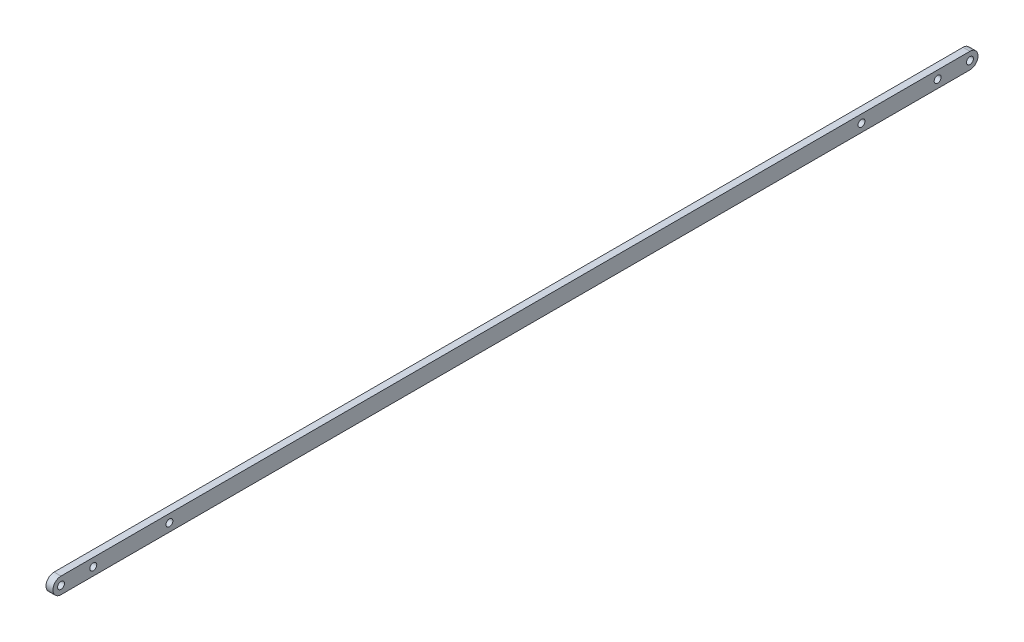
ISO-10303-21;
HEADER;
FILE_DESCRIPTION(('STEP AP214'),'2;1');
FILE_NAME('part.step','',(''),(''),'','','');
FILE_SCHEMA(('AUTOMOTIVE_DESIGN { 1 0 10303 214 1 1 1 1 }'));
ENDSEC;
DATA;
#1=APPLICATION_CONTEXT('core data for automotive mechanical design processes');
#2=APPLICATION_PROTOCOL_DEFINITION('international standard','automotive_design',2000,#1);
#3=PRODUCT_CONTEXT('',#1,'mechanical');
#4=PRODUCT('Part','Part','',(#3));
#5=PRODUCT_RELATED_PRODUCT_CATEGORY('part','',(#4));
#6=PRODUCT_DEFINITION_FORMATION('','',#4);
#7=PRODUCT_DEFINITION_CONTEXT('part definition',#1,'design');
#8=PRODUCT_DEFINITION('design','',#6,#7);
#9=PRODUCT_DEFINITION_SHAPE('','',#8);
#10=(LENGTH_UNIT() NAMED_UNIT(*) SI_UNIT(.MILLI.,.METRE.));
#11=(NAMED_UNIT(*) PLANE_ANGLE_UNIT() SI_UNIT($,.RADIAN.));
#12=(NAMED_UNIT(*) SI_UNIT($,.STERADIAN.) SOLID_ANGLE_UNIT());
#13=UNCERTAINTY_MEASURE_WITH_UNIT(LENGTH_MEASURE(1.E-05),#10,'distance_accuracy_value','');
#14=(GEOMETRIC_REPRESENTATION_CONTEXT(3) GLOBAL_UNCERTAINTY_ASSIGNED_CONTEXT((#13)) GLOBAL_UNIT_ASSIGNED_CONTEXT((#10,
#11,#12)) REPRESENTATION_CONTEXT('',''));
#15=CARTESIAN_POINT('',(0.,0.,0.));
#16=DIRECTION('',(0.,0.,1.));
#17=DIRECTION('',(1.,0.,0.));
#18=AXIS2_PLACEMENT_3D('',#15,#16,#17);
#19=CARTESIAN_POINT('',(3.,1.5,0.));
#20=DIRECTION('',(1.,0.,0.));
#21=DIRECTION('',(0.,0.,-1.));
#22=AXIS2_PLACEMENT_3D('',#19,#20,#21);
#23=PLANE('',#22);
#24=CARTESIAN_POINT('',(3.,1.5,-47.));
#25=DIRECTION('',(1.,0.,0.));
#26=DIRECTION('',(0.,0.,-1.));
#27=AXIS2_PLACEMENT_3D('',#24,#25,#26);
#28=CIRCLE('',#27,1.5);
#29=CARTESIAN_POINT('',(3.,1.5,-48.5));
#30=VERTEX_POINT('',#29);
#31=EDGE_CURVE('E162',#30,#30,#28,.T.);
#32=ORIENTED_EDGE('',*,*,#31,.F.);
#33=EDGE_LOOP('',(#32));
#34=FACE_BOUND('',#33,.T.);
#35=CARTESIAN_POINT('',(3.,1.5,-14.));
#36=DIRECTION('',(1.,0.,0.));
#37=DIRECTION('',(0.,0.,-1.));
#38=AXIS2_PLACEMENT_3D('',#35,#36,#37);
#39=CIRCLE('',#38,1.5);
#40=CARTESIAN_POINT('',(3.,1.5,-15.5));
#41=VERTEX_POINT('',#40);
#42=EDGE_CURVE('E146',#41,#41,#39,.T.);
#43=ORIENTED_EDGE('',*,*,#42,.F.);
#44=EDGE_LOOP('',(#43));
#45=FACE_BOUND('',#44,.T.);
#46=CARTESIAN_POINT('',(3.,1.5,0.));
#47=DIRECTION('',(1.,0.,0.));
#48=DIRECTION('',(0.,0.,1.));
#49=AXIS2_PLACEMENT_3D('',#46,#47,#48);
#50=CIRCLE('',#49,1.5);
#51=CARTESIAN_POINT('',(3.,1.5,1.5));
#52=VERTEX_POINT('',#51);
#53=EDGE_CURVE('E116',#52,#52,#50,.T.);
#54=ORIENTED_EDGE('',*,*,#53,.F.);
#55=EDGE_LOOP('',(#54));
#56=FACE_BOUND('',#55,.T.);
#57=CARTESIAN_POINT('',(3.,1.5,0.));
#58=DIRECTION('',(1.,0.,0.));
#59=DIRECTION('',(0.,0.,-1.));
#60=AXIS2_PLACEMENT_3D('',#57,#58,#59);
#61=CIRCLE('',#60,3.5);
#62=CARTESIAN_POINT('',(3.,5.,0.));
#63=VERTEX_POINT('',#62);
#64=CARTESIAN_POINT('',(3.,-2.,0.));
#65=VERTEX_POINT('',#64);
#66=EDGE_CURVE('E96',#63,#65,#61,.T.);
#67=ORIENTED_EDGE('',*,*,#66,.T.);
#68=DIRECTION('',(0.,0.,-1.));
#69=VECTOR('',#68,1.);
#70=CARTESIAN_POINT('',(3.,-2.,0.));
#71=LINE('',#70,#69);
#72=CARTESIAN_POINT('',(3.,-2.,-394.));
#73=VERTEX_POINT('',#72);
#74=EDGE_CURVE('E91',#65,#73,#71,.T.);
#75=ORIENTED_EDGE('',*,*,#74,.T.);
#76=CARTESIAN_POINT('',(3.,1.5,-394.));
#77=DIRECTION('',(1.,0.,0.));
#78=DIRECTION('',(0.,0.,1.));
#79=AXIS2_PLACEMENT_3D('',#76,#77,#78);
#80=CIRCLE('',#79,3.5);
#81=CARTESIAN_POINT('',(3.,5.,-394.));
#82=VERTEX_POINT('',#81);
#83=EDGE_CURVE('E94',#73,#82,#80,.T.);
#84=ORIENTED_EDGE('',*,*,#83,.T.);
#85=DIRECTION('',(0.,0.,1.));
#86=VECTOR('',#85,1.);
#87=CARTESIAN_POINT('',(3.,5.,0.));
#88=LINE('',#87,#86);
#89=EDGE_CURVE('E61',#82,#63,#88,.T.);
#90=ORIENTED_EDGE('',*,*,#89,.T.);
#91=EDGE_LOOP('',(#67,#75,#84,#90));
#92=FACE_BOUND('',#91,.T.);
#93=CARTESIAN_POINT('',(3.,1.5,-394.));
#94=DIRECTION('',(1.,0.,0.));
#95=DIRECTION('',(0.,0.,1.));
#96=AXIS2_PLACEMENT_3D('',#93,#94,#95);
#97=CIRCLE('',#96,1.5);
#98=CARTESIAN_POINT('',(3.,1.5,-392.5));
#99=VERTEX_POINT('',#98);
#100=EDGE_CURVE('E138',#99,#99,#97,.T.);
#101=ORIENTED_EDGE('',*,*,#100,.F.);
#102=EDGE_LOOP('',(#101));
#103=FACE_BOUND('',#102,.T.);
#104=CARTESIAN_POINT('',(3.,1.5,-380.));
#105=DIRECTION('',(1.,0.,0.));
#106=DIRECTION('',(0.,0.,-1.));
#107=AXIS2_PLACEMENT_3D('',#104,#105,#106);
#108=CIRCLE('',#107,1.50000000000002);
#109=CARTESIAN_POINT('',(3.,1.5,-381.5));
#110=VERTEX_POINT('',#109);
#111=EDGE_CURVE('E154',#110,#110,#108,.T.);
#112=ORIENTED_EDGE('',*,*,#111,.F.);
#113=EDGE_LOOP('',(#112));
#114=FACE_BOUND('',#113,.T.);
#115=CARTESIAN_POINT('',(3.,1.5,-347.));
#116=DIRECTION('',(1.,0.,0.));
#117=DIRECTION('',(0.,0.,-1.));
#118=AXIS2_PLACEMENT_3D('',#115,#116,#117);
#119=CIRCLE('',#118,1.50000000000002);
#120=CARTESIAN_POINT('',(3.,1.5,-348.5));
#121=VERTEX_POINT('',#120);
#122=EDGE_CURVE('E170',#121,#121,#119,.T.);
#123=ORIENTED_EDGE('',*,*,#122,.F.);
#124=EDGE_LOOP('',(#123));
#125=FACE_BOUND('',#124,.T.);
#126=ADVANCED_FACE('F43',(#34,#45,#56,#92,#103,#114,#125),#23,.T.);
#127=CARTESIAN_POINT('',(0.,1.5,0.));
#128=DIRECTION('',(1.,0.,0.));
#129=DIRECTION('',(0.,0.,-1.));
#130=AXIS2_PLACEMENT_3D('',#127,#128,#129);
#131=PLANE('',#130);
#132=CARTESIAN_POINT('',(0.,1.5,0.));
#133=DIRECTION('',(1.,0.,0.));
#134=DIRECTION('',(0.,0.,-1.));
#135=AXIS2_PLACEMENT_3D('',#132,#133,#134);
#136=CIRCLE('',#135,3.5);
#137=CARTESIAN_POINT('',(0.,5.,0.));
#138=VERTEX_POINT('',#137);
#139=CARTESIAN_POINT('',(0.,-2.,0.));
#140=VERTEX_POINT('',#139);
#141=EDGE_CURVE('E112',#138,#140,#136,.T.);
#142=ORIENTED_EDGE('',*,*,#141,.F.);
#143=DIRECTION('',(0.,0.,1.));
#144=VECTOR('',#143,1.);
#145=CARTESIAN_POINT('',(0.,5.,0.));
#146=LINE('',#145,#144);
#147=CARTESIAN_POINT('',(0.,5.,-394.));
#148=VERTEX_POINT('',#147);
#149=EDGE_CURVE('E84',#148,#138,#146,.T.);
#150=ORIENTED_EDGE('',*,*,#149,.F.);
#151=CARTESIAN_POINT('',(0.,1.5,-394.));
#152=DIRECTION('',(1.,0.,0.));
#153=DIRECTION('',(0.,0.,1.));
#154=AXIS2_PLACEMENT_3D('',#151,#152,#153);
#155=CIRCLE('',#154,3.5);
#156=CARTESIAN_POINT('',(0.,-2.,-394.));
#157=VERTEX_POINT('',#156);
#158=EDGE_CURVE('E78',#157,#148,#155,.T.);
#159=ORIENTED_EDGE('',*,*,#158,.F.);
#160=DIRECTION('',(0.,0.,-1.));
#161=VECTOR('',#160,1.);
#162=CARTESIAN_POINT('',(0.,-2.,0.));
#163=LINE('',#162,#161);
#164=EDGE_CURVE('E101',#140,#157,#163,.T.);
#165=ORIENTED_EDGE('',*,*,#164,.F.);
#166=EDGE_LOOP('',(#142,#150,#159,#165));
#167=FACE_BOUND('',#166,.T.);
#168=CARTESIAN_POINT('',(0.,1.5,0.));
#169=DIRECTION('',(1.,0.,0.));
#170=DIRECTION('',(0.,0.,-1.));
#171=AXIS2_PLACEMENT_3D('',#168,#169,#170);
#172=CIRCLE('',#171,1.5);
#173=CARTESIAN_POINT('',(0.,1.5,-1.5));
#174=VERTEX_POINT('',#173);
#175=EDGE_CURVE('E134',#174,#174,#172,.T.);
#176=ORIENTED_EDGE('',*,*,#175,.T.);
#177=EDGE_LOOP('',(#176));
#178=FACE_BOUND('',#177,.T.);
#179=CARTESIAN_POINT('',(0.,1.5,-394.));
#180=DIRECTION('',(1.,0.,0.));
#181=DIRECTION('',(0.,0.,1.));
#182=AXIS2_PLACEMENT_3D('',#179,#180,#181);
#183=CIRCLE('',#182,1.5);
#184=CARTESIAN_POINT('',(0.,1.5,-392.5));
#185=VERTEX_POINT('',#184);
#186=EDGE_CURVE('E142',#185,#185,#183,.T.);
#187=ORIENTED_EDGE('',*,*,#186,.T.);
#188=EDGE_LOOP('',(#187));
#189=FACE_BOUND('',#188,.T.);
#190=CARTESIAN_POINT('',(0.,1.5,-14.));
#191=DIRECTION('',(1.,0.,0.));
#192=DIRECTION('',(0.,0.,-1.));
#193=AXIS2_PLACEMENT_3D('',#190,#191,#192);
#194=CIRCLE('',#193,1.5);
#195=CARTESIAN_POINT('',(0.,1.5,-15.5));
#196=VERTEX_POINT('',#195);
#197=EDGE_CURVE('E150',#196,#196,#194,.T.);
#198=ORIENTED_EDGE('',*,*,#197,.T.);
#199=EDGE_LOOP('',(#198));
#200=FACE_BOUND('',#199,.T.);
#201=CARTESIAN_POINT('',(0.,1.5,-380.));
#202=DIRECTION('',(1.,0.,0.));
#203=DIRECTION('',(0.,0.,-1.));
#204=AXIS2_PLACEMENT_3D('',#201,#202,#203);
#205=CIRCLE('',#204,1.50000000000002);
#206=CARTESIAN_POINT('',(0.,1.5,-381.5));
#207=VERTEX_POINT('',#206);
#208=EDGE_CURVE('E158',#207,#207,#205,.T.);
#209=ORIENTED_EDGE('',*,*,#208,.T.);
#210=EDGE_LOOP('',(#209));
#211=FACE_BOUND('',#210,.T.);
#212=CARTESIAN_POINT('',(0.,1.5,-47.));
#213=DIRECTION('',(1.,0.,0.));
#214=DIRECTION('',(0.,0.,-1.));
#215=AXIS2_PLACEMENT_3D('',#212,#213,#214);
#216=CIRCLE('',#215,1.5);
#217=CARTESIAN_POINT('',(0.,1.5,-48.5));
#218=VERTEX_POINT('',#217);
#219=EDGE_CURVE('E166',#218,#218,#216,.T.);
#220=ORIENTED_EDGE('',*,*,#219,.T.);
#221=EDGE_LOOP('',(#220));
#222=FACE_BOUND('',#221,.T.);
#223=CARTESIAN_POINT('',(0.,1.5,-347.));
#224=DIRECTION('',(1.,0.,0.));
#225=DIRECTION('',(0.,0.,-1.));
#226=AXIS2_PLACEMENT_3D('',#223,#224,#225);
#227=CIRCLE('',#226,1.50000000000002);
#228=CARTESIAN_POINT('',(0.,1.5,-348.5));
#229=VERTEX_POINT('',#228);
#230=EDGE_CURVE('E174',#229,#229,#227,.T.);
#231=ORIENTED_EDGE('',*,*,#230,.T.);
#232=EDGE_LOOP('',(#231));
#233=FACE_BOUND('',#232,.T.);
#234=ADVANCED_FACE('F129',(#167,#178,#189,#200,#211,#222,#233),#131,.F.);
#235=CARTESIAN_POINT('',(3.,1.5,0.));
#236=DIRECTION('',(-1.,0.,0.));
#237=DIRECTION('',(0.,0.,1.));
#238=AXIS2_PLACEMENT_3D('',#235,#236,#237);
#239=CYLINDRICAL_SURFACE('',#238,3.5);
#240=ORIENTED_EDGE('',*,*,#141,.T.);
#241=DIRECTION('',(-1.,0.,0.));
#242=VECTOR('',#241,1.);
#243=CARTESIAN_POINT('',(3.,-2.,0.));
#244=LINE('',#243,#242);
#245=EDGE_CURVE('E11',#65,#140,#244,.T.);
#246=ORIENTED_EDGE('',*,*,#245,.F.);
#247=ORIENTED_EDGE('',*,*,#66,.F.);
#248=DIRECTION('',(-1.,0.,0.));
#249=VECTOR('',#248,1.);
#250=CARTESIAN_POINT('',(3.,5.,0.));
#251=LINE('',#250,#249);
#252=EDGE_CURVE('E108',#63,#138,#251,.T.);
#253=ORIENTED_EDGE('',*,*,#252,.T.);
#254=EDGE_LOOP('',(#240,#246,#247,#253));
#255=FACE_BOUND('',#254,.T.);
#256=ADVANCED_FACE('F45',(#255),#239,.T.);
#257=CARTESIAN_POINT('',(3.,-2.,0.));
#258=DIRECTION('',(0.,1.,0.));
#259=DIRECTION('',(0.,0.,1.));
#260=AXIS2_PLACEMENT_3D('',#257,#258,#259);
#261=PLANE('',#260);
#262=ORIENTED_EDGE('',*,*,#164,.T.);
#263=DIRECTION('',(-1.,0.,0.));
#264=VECTOR('',#263,1.);
#265=CARTESIAN_POINT('',(3.,-2.,-394.));
#266=LINE('',#265,#264);
#267=EDGE_CURVE('E53',#73,#157,#266,.T.);
#268=ORIENTED_EDGE('',*,*,#267,.F.);
#269=ORIENTED_EDGE('',*,*,#74,.F.);
#270=ORIENTED_EDGE('',*,*,#245,.T.);
#271=EDGE_LOOP('',(#262,#268,#269,#270));
#272=FACE_BOUND('',#271,.T.);
#273=ADVANCED_FACE('F100',(#272),#261,.F.);
#274=CARTESIAN_POINT('',(3.,1.5,-394.));
#275=DIRECTION('',(-1.,0.,0.));
#276=DIRECTION('',(0.,0.,1.));
#277=AXIS2_PLACEMENT_3D('',#274,#275,#276);
#278=CYLINDRICAL_SURFACE('',#277,3.5);
#279=ORIENTED_EDGE('',*,*,#158,.T.);
#280=DIRECTION('',(-1.,0.,0.));
#281=VECTOR('',#280,1.);
#282=CARTESIAN_POINT('',(3.,5.,-394.));
#283=LINE('',#282,#281);
#284=EDGE_CURVE('E103',#82,#148,#283,.T.);
#285=ORIENTED_EDGE('',*,*,#284,.F.);
#286=ORIENTED_EDGE('',*,*,#83,.F.);
#287=ORIENTED_EDGE('',*,*,#267,.T.);
#288=EDGE_LOOP('',(#279,#285,#286,#287));
#289=FACE_BOUND('',#288,.T.);
#290=ADVANCED_FACE('F104',(#289),#278,.T.);
#291=CARTESIAN_POINT('',(3.,5.,0.));
#292=DIRECTION('',(0.,-1.,0.));
#293=DIRECTION('',(0.,0.,-1.));
#294=AXIS2_PLACEMENT_3D('',#291,#292,#293);
#295=PLANE('',#294);
#296=ORIENTED_EDGE('',*,*,#149,.T.);
#297=ORIENTED_EDGE('',*,*,#252,.F.);
#298=ORIENTED_EDGE('',*,*,#89,.F.);
#299=ORIENTED_EDGE('',*,*,#284,.T.);
#300=EDGE_LOOP('',(#296,#297,#298,#299));
#301=FACE_BOUND('',#300,.T.);
#302=ADVANCED_FACE('F126',(#301),#295,.F.);
#303=CARTESIAN_POINT('',(3.,1.5,0.));
#304=DIRECTION('',(-1.,0.,0.));
#305=DIRECTION('',(0.,0.,1.));
#306=AXIS2_PLACEMENT_3D('',#303,#304,#305);
#307=CYLINDRICAL_SURFACE('',#306,1.5);
#308=ORIENTED_EDGE('',*,*,#175,.F.);
#309=EDGE_LOOP('',(#308));
#310=FACE_BOUND('',#309,.T.);
#311=ORIENTED_EDGE('',*,*,#53,.T.);
#312=EDGE_LOOP('',(#311));
#313=FACE_BOUND('',#312,.T.);
#314=ADVANCED_FACE('F195',(#310,#313),#307,.F.);
#315=CARTESIAN_POINT('',(3.,1.5,-394.));
#316=DIRECTION('',(-1.,0.,0.));
#317=DIRECTION('',(0.,0.,1.));
#318=AXIS2_PLACEMENT_3D('',#315,#316,#317);
#319=CYLINDRICAL_SURFACE('',#318,1.5);
#320=ORIENTED_EDGE('',*,*,#186,.F.);
#321=EDGE_LOOP('',(#320));
#322=FACE_BOUND('',#321,.T.);
#323=ORIENTED_EDGE('',*,*,#100,.T.);
#324=EDGE_LOOP('',(#323));
#325=FACE_BOUND('',#324,.T.);
#326=ADVANCED_FACE('F249',(#322,#325),#319,.F.);
#327=CARTESIAN_POINT('',(3.,1.5,-14.));
#328=DIRECTION('',(-1.,0.,0.));
#329=DIRECTION('',(0.,0.,1.));
#330=AXIS2_PLACEMENT_3D('',#327,#328,#329);
#331=CYLINDRICAL_SURFACE('',#330,1.5);
#332=ORIENTED_EDGE('',*,*,#42,.T.);
#333=EDGE_LOOP('',(#332));
#334=FACE_BOUND('',#333,.T.);
#335=ORIENTED_EDGE('',*,*,#197,.F.);
#336=EDGE_LOOP('',(#335));
#337=FACE_BOUND('',#336,.T.);
#338=ADVANCED_FACE('F258',(#334,#337),#331,.F.);
#339=CARTESIAN_POINT('',(3.,1.5,-380.));
#340=DIRECTION('',(-1.,0.,0.));
#341=DIRECTION('',(0.,0.,1.));
#342=AXIS2_PLACEMENT_3D('',#339,#340,#341);
#343=CYLINDRICAL_SURFACE('',#342,1.50000000000002);
#344=ORIENTED_EDGE('',*,*,#111,.T.);
#345=EDGE_LOOP('',(#344));
#346=FACE_BOUND('',#345,.T.);
#347=ORIENTED_EDGE('',*,*,#208,.F.);
#348=EDGE_LOOP('',(#347));
#349=FACE_BOUND('',#348,.T.);
#350=ADVANCED_FACE('F267',(#346,#349),#343,.F.);
#351=CARTESIAN_POINT('',(3.,1.5,-47.));
#352=DIRECTION('',(-1.,0.,0.));
#353=DIRECTION('',(0.,0.,1.));
#354=AXIS2_PLACEMENT_3D('',#351,#352,#353);
#355=CYLINDRICAL_SURFACE('',#354,1.5);
#356=ORIENTED_EDGE('',*,*,#31,.T.);
#357=EDGE_LOOP('',(#356));
#358=FACE_BOUND('',#357,.T.);
#359=ORIENTED_EDGE('',*,*,#219,.F.);
#360=EDGE_LOOP('',(#359));
#361=FACE_BOUND('',#360,.T.);
#362=ADVANCED_FACE('F277',(#358,#361),#355,.F.);
#363=CARTESIAN_POINT('',(3.,1.5,-347.));
#364=DIRECTION('',(-1.,0.,0.));
#365=DIRECTION('',(0.,0.,1.));
#366=AXIS2_PLACEMENT_3D('',#363,#364,#365);
#367=CYLINDRICAL_SURFACE('',#366,1.50000000000002);
#368=ORIENTED_EDGE('',*,*,#122,.T.);
#369=EDGE_LOOP('',(#368));
#370=FACE_BOUND('',#369,.T.);
#371=ORIENTED_EDGE('',*,*,#230,.F.);
#372=EDGE_LOOP('',(#371));
#373=FACE_BOUND('',#372,.T.);
#374=ADVANCED_FACE('F182',(#370,#373),#367,.F.);
#375=CLOSED_SHELL('',(#126,#234,#256,#273,#290,#302,#314,#326,#338,#350,#362,#374));
#376=MANIFOLD_SOLID_BREP('B2',#375);
#377=ADVANCED_BREP_SHAPE_REPRESENTATION('',(#18,#376),#14);
#378=SHAPE_DEFINITION_REPRESENTATION(#9,#377);
ENDSEC;
END-ISO-10303-21;
